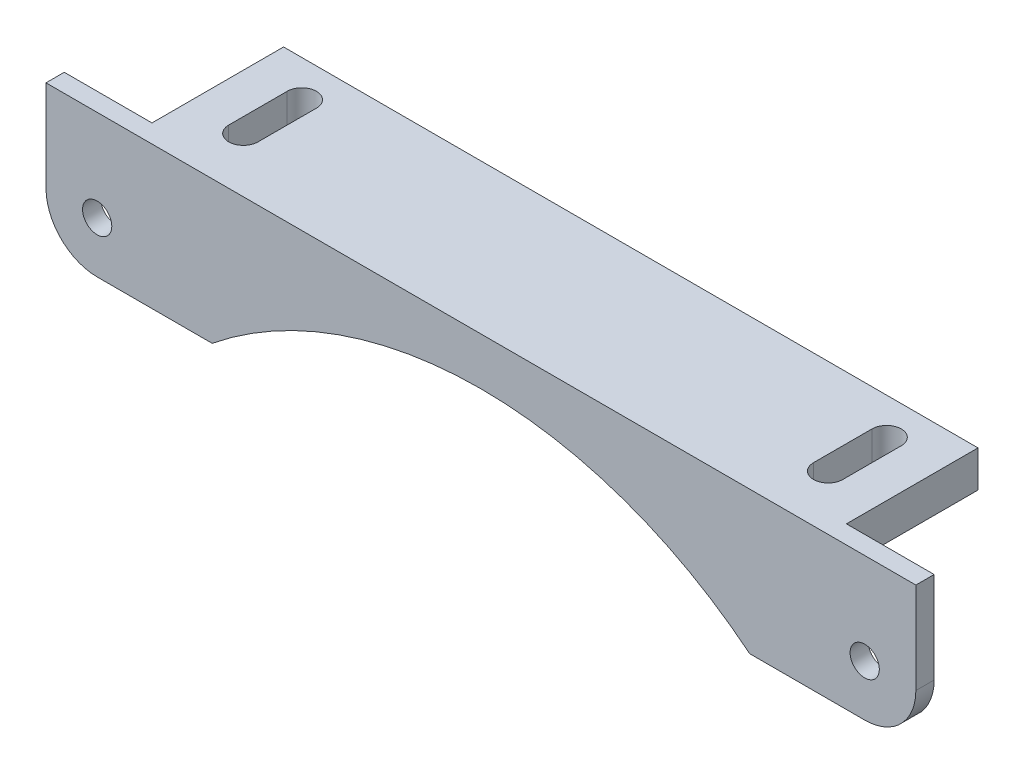
ISO-10303-21;
HEADER;
FILE_DESCRIPTION(('STEP AP214'),'2;1');
FILE_NAME('part.step','',(''),(''),'','','');
FILE_SCHEMA(('AUTOMOTIVE_DESIGN { 1 0 10303 214 1 1 1 1 }'));
ENDSEC;
DATA;
#1=APPLICATION_CONTEXT('core data for automotive mechanical design processes');
#2=APPLICATION_PROTOCOL_DEFINITION('international standard','automotive_design',2000,#1);
#3=PRODUCT_CONTEXT('',#1,'mechanical');
#4=PRODUCT('Part','Part','',(#3));
#5=PRODUCT_RELATED_PRODUCT_CATEGORY('part','',(#4));
#6=PRODUCT_DEFINITION_FORMATION('','',#4);
#7=PRODUCT_DEFINITION_CONTEXT('part definition',#1,'design');
#8=PRODUCT_DEFINITION('design','',#6,#7);
#9=PRODUCT_DEFINITION_SHAPE('','',#8);
#10=(LENGTH_UNIT() NAMED_UNIT(*) SI_UNIT(.MILLI.,.METRE.));
#11=(NAMED_UNIT(*) PLANE_ANGLE_UNIT() SI_UNIT($,.RADIAN.));
#12=(NAMED_UNIT(*) SI_UNIT($,.STERADIAN.) SOLID_ANGLE_UNIT());
#13=UNCERTAINTY_MEASURE_WITH_UNIT(LENGTH_MEASURE(1.E-05),#10,'distance_accuracy_value','');
#14=(GEOMETRIC_REPRESENTATION_CONTEXT(3) GLOBAL_UNCERTAINTY_ASSIGNED_CONTEXT((#13)) GLOBAL_UNIT_ASSIGNED_CONTEXT((#10,
#11,#12)) REPRESENTATION_CONTEXT('',''));
#15=CARTESIAN_POINT('',(0.,0.,0.));
#16=DIRECTION('',(0.,0.,1.));
#17=DIRECTION('',(1.,0.,0.));
#18=AXIS2_PLACEMENT_3D('',#15,#16,#17);
#19=CARTESIAN_POINT('',(0.,5.,0.));
#20=DIRECTION('',(0.,1.,0.));
#21=DIRECTION('',(0.,0.,1.));
#22=AXIS2_PLACEMENT_3D('',#19,#20,#21);
#23=PLANE('',#22);
#24=DIRECTION('',(0.,0.,1.));
#25=VECTOR('',#24,1.);
#26=CARTESIAN_POINT('',(-47.5,5.,9.00000000000001));
#27=LINE('',#26,#25);
#28=CARTESIAN_POINT('',(-47.5,5.,-8.99999999999999));
#29=VERTEX_POINT('',#28);
#30=CARTESIAN_POINT('',(-47.5,5.,9.00000000000001));
#31=VERTEX_POINT('',#30);
#32=EDGE_CURVE('E313',#29,#31,#27,.T.);
#33=ORIENTED_EDGE('',*,*,#32,.T.);
#34=DIRECTION('',(-1.,0.,0.));
#35=VECTOR('',#34,1.);
#36=CARTESIAN_POINT('',(0.,5.00000000000001,9.));
#37=LINE('',#36,#35);
#38=CARTESIAN_POINT('',(-59.5,5.,9.));
#39=VERTEX_POINT('',#38);
#40=EDGE_CURVE('E188',#31,#39,#37,.T.);
#41=ORIENTED_EDGE('',*,*,#40,.T.);
#42=DIRECTION('',(0.,0.,-1.));
#43=VECTOR('',#42,1.);
#44=CARTESIAN_POINT('',(-59.5,5.,11.5));
#45=LINE('',#44,#43);
#46=CARTESIAN_POINT('',(-59.5,5.,11.5));
#47=VERTEX_POINT('',#46);
#48=EDGE_CURVE('E185',#47,#39,#45,.T.);
#49=ORIENTED_EDGE('',*,*,#48,.F.);
#50=DIRECTION('',(-1.,0.,0.));
#51=VECTOR('',#50,1.);
#52=CARTESIAN_POINT('',(0.,5.00000000000001,11.5));
#53=LINE('',#52,#51);
#54=CARTESIAN_POINT('',(59.5,5.,11.5));
#55=VERTEX_POINT('',#54);
#56=EDGE_CURVE('E173',#55,#47,#53,.T.);
#57=ORIENTED_EDGE('',*,*,#56,.F.);
#58=DIRECTION('',(0.,0.,-1.));
#59=VECTOR('',#58,1.);
#60=CARTESIAN_POINT('',(59.5,5.,11.5));
#61=LINE('',#60,#59);
#62=CARTESIAN_POINT('',(59.5,5.,9.));
#63=VERTEX_POINT('',#62);
#64=EDGE_CURVE('E215',#55,#63,#61,.T.);
#65=ORIENTED_EDGE('',*,*,#64,.T.);
#66=CARTESIAN_POINT('',(47.5,5.,9.));
#67=VERTEX_POINT('',#66);
#68=EDGE_CURVE('E216',#63,#67,#37,.T.);
#69=ORIENTED_EDGE('',*,*,#68,.T.);
#70=DIRECTION('',(0.,0.,-1.));
#71=VECTOR('',#70,1.);
#72=CARTESIAN_POINT('',(47.5,5.,9.));
#73=LINE('',#72,#71);
#74=CARTESIAN_POINT('',(47.5,5.,-9.00000000000001));
#75=VERTEX_POINT('',#74);
#76=EDGE_CURVE('E315',#67,#75,#73,.T.);
#77=ORIENTED_EDGE('',*,*,#76,.T.);
#78=DIRECTION('',(-1.,0.,0.));
#79=VECTOR('',#78,1.);
#80=CARTESIAN_POINT('',(47.5,5.,-9.00000000000001));
#81=LINE('',#80,#79);
#82=EDGE_CURVE('E318',#75,#29,#81,.T.);
#83=ORIENTED_EDGE('',*,*,#82,.T.);
#84=EDGE_LOOP('',(#33,#41,#49,#57,#65,#69,#77,#83));
#85=FACE_BOUND('',#84,.T.);
#86=DIRECTION('',(0.,0.,1.));
#87=VECTOR('',#86,1.);
#88=CARTESIAN_POINT('',(-42.,5.,-3.99999999999996));
#89=LINE('',#88,#87);
#90=CARTESIAN_POINT('',(-42.,5.,-3.99999999999996));
#91=VERTEX_POINT('',#90);
#92=CARTESIAN_POINT('',(-42.,5.,3.99999999999998));
#93=VERTEX_POINT('',#92);
#94=EDGE_CURVE('E284',#91,#93,#89,.T.);
#95=ORIENTED_EDGE('',*,*,#94,.F.);
#96=CARTESIAN_POINT('',(-40.,5.,-4.00000000000002));
#97=DIRECTION('',(0.,1.,0.));
#98=DIRECTION('',(0.,0.,1.));
#99=AXIS2_PLACEMENT_3D('',#96,#97,#98);
#100=CIRCLE('',#99,2.);
#101=CARTESIAN_POINT('',(-38.,5.,-3.99999999999997));
#102=VERTEX_POINT('',#101);
#103=EDGE_CURVE('E282',#102,#91,#100,.T.);
#104=ORIENTED_EDGE('',*,*,#103,.F.);
#105=DIRECTION('',(0.,0.,-1.));
#106=VECTOR('',#105,1.);
#107=CARTESIAN_POINT('',(-38.,5.,-3.99999999999997));
#108=LINE('',#107,#106);
#109=CARTESIAN_POINT('',(-38.,5.,3.99999999999998));
#110=VERTEX_POINT('',#109);
#111=EDGE_CURVE('E290',#110,#102,#108,.T.);
#112=ORIENTED_EDGE('',*,*,#111,.F.);
#113=CARTESIAN_POINT('',(-40.,5.,3.99999999999998));
#114=DIRECTION('',(0.,1.,0.));
#115=DIRECTION('',(0.,0.,1.));
#116=AXIS2_PLACEMENT_3D('',#113,#114,#115);
#117=CIRCLE('',#116,2.);
#118=EDGE_CURVE('E287',#93,#110,#117,.T.);
#119=ORIENTED_EDGE('',*,*,#118,.F.);
#120=EDGE_LOOP('',(#95,#104,#112,#119));
#121=FACE_BOUND('',#120,.T.);
#122=DIRECTION('',(0.,0.,1.));
#123=VECTOR('',#122,1.);
#124=CARTESIAN_POINT('',(38.,5.,-4.));
#125=LINE('',#124,#123);
#126=CARTESIAN_POINT('',(38.,5.,-4.));
#127=VERTEX_POINT('',#126);
#128=CARTESIAN_POINT('',(38.,5.,4.));
#129=VERTEX_POINT('',#128);
#130=EDGE_CURVE('E258',#127,#129,#125,.T.);
#131=ORIENTED_EDGE('',*,*,#130,.F.);
#132=CARTESIAN_POINT('',(40.,5.,-4.));
#133=DIRECTION('',(0.,1.,0.));
#134=DIRECTION('',(0.,0.,1.));
#135=AXIS2_PLACEMENT_3D('',#132,#133,#134);
#136=CIRCLE('',#135,2.);
#137=CARTESIAN_POINT('',(42.,5.,-4.));
#138=VERTEX_POINT('',#137);
#139=EDGE_CURVE('E256',#138,#127,#136,.T.);
#140=ORIENTED_EDGE('',*,*,#139,.F.);
#141=DIRECTION('',(0.,0.,-1.));
#142=VECTOR('',#141,1.);
#143=CARTESIAN_POINT('',(42.,5.,-4.));
#144=LINE('',#143,#142);
#145=CARTESIAN_POINT('',(42.,5.,4.));
#146=VERTEX_POINT('',#145);
#147=EDGE_CURVE('E263',#146,#138,#144,.T.);
#148=ORIENTED_EDGE('',*,*,#147,.F.);
#149=CARTESIAN_POINT('',(40.,5.,4.));
#150=DIRECTION('',(0.,1.,0.));
#151=DIRECTION('',(0.,0.,1.));
#152=AXIS2_PLACEMENT_3D('',#149,#150,#151);
#153=CIRCLE('',#152,2.);
#154=EDGE_CURVE('E261',#129,#146,#153,.T.);
#155=ORIENTED_EDGE('',*,*,#154,.F.);
#156=EDGE_LOOP('',(#131,#140,#148,#155));
#157=FACE_BOUND('',#156,.T.);
#158=ADVANCED_FACE('F33',(#85,#121,#157),#23,.T.);
#159=CARTESIAN_POINT('',(0.,0.,0.));
#160=DIRECTION('',(0.,1.,0.));
#161=DIRECTION('',(0.,0.,1.));
#162=AXIS2_PLACEMENT_3D('',#159,#160,#161);
#163=PLANE('',#162);
#164=CARTESIAN_POINT('',(-40.,0.,-4.00000000000002));
#165=DIRECTION('',(0.,1.,0.));
#166=DIRECTION('',(0.,0.,1.));
#167=AXIS2_PLACEMENT_3D('',#164,#165,#166);
#168=CIRCLE('',#167,2.);
#169=CARTESIAN_POINT('',(-38.,0.,-3.99999999999997));
#170=VERTEX_POINT('',#169);
#171=CARTESIAN_POINT('',(-42.,0.,-3.99999999999996));
#172=VERTEX_POINT('',#171);
#173=EDGE_CURVE('E281',#170,#172,#168,.T.);
#174=ORIENTED_EDGE('',*,*,#173,.T.);
#175=DIRECTION('',(0.,0.,1.));
#176=VECTOR('',#175,1.);
#177=CARTESIAN_POINT('',(-42.,0.,-3.99999999999996));
#178=LINE('',#177,#176);
#179=CARTESIAN_POINT('',(-42.,0.,3.99999999999998));
#180=VERTEX_POINT('',#179);
#181=EDGE_CURVE('E295',#172,#180,#178,.T.);
#182=ORIENTED_EDGE('',*,*,#181,.T.);
#183=CARTESIAN_POINT('',(-40.,0.,3.99999999999998));
#184=DIRECTION('',(0.,1.,0.));
#185=DIRECTION('',(0.,0.,1.));
#186=AXIS2_PLACEMENT_3D('',#183,#184,#185);
#187=CIRCLE('',#186,2.);
#188=CARTESIAN_POINT('',(-38.,0.,3.99999999999998));
#189=VERTEX_POINT('',#188);
#190=EDGE_CURVE('E298',#180,#189,#187,.T.);
#191=ORIENTED_EDGE('',*,*,#190,.T.);
#192=DIRECTION('',(0.,0.,-1.));
#193=VECTOR('',#192,1.);
#194=CARTESIAN_POINT('',(-38.,0.,-3.99999999999997));
#195=LINE('',#194,#193);
#196=EDGE_CURVE('E285',#189,#170,#195,.T.);
#197=ORIENTED_EDGE('',*,*,#196,.T.);
#198=EDGE_LOOP('',(#174,#182,#191,#197));
#199=FACE_BOUND('',#198,.T.);
#200=DIRECTION('',(0.,0.,1.));
#201=VECTOR('',#200,1.);
#202=CARTESIAN_POINT('',(-47.5,0.,9.00000000000001));
#203=LINE('',#202,#201);
#204=CARTESIAN_POINT('',(-47.5,0.,-8.99999999999999));
#205=VERTEX_POINT('',#204);
#206=CARTESIAN_POINT('',(-47.5,0.,9.00000000000001));
#207=VERTEX_POINT('',#206);
#208=EDGE_CURVE('E312',#205,#207,#203,.T.);
#209=ORIENTED_EDGE('',*,*,#208,.F.);
#210=DIRECTION('',(-1.,0.,0.));
#211=VECTOR('',#210,1.);
#212=CARTESIAN_POINT('',(47.5,0.,-9.00000000000001));
#213=LINE('',#212,#211);
#214=CARTESIAN_POINT('',(47.5,0.,-9.00000000000001));
#215=VERTEX_POINT('',#214);
#216=EDGE_CURVE('E316',#215,#205,#213,.T.);
#217=ORIENTED_EDGE('',*,*,#216,.F.);
#218=DIRECTION('',(0.,0.,-1.));
#219=VECTOR('',#218,1.);
#220=CARTESIAN_POINT('',(47.5,0.,9.));
#221=LINE('',#220,#219);
#222=CARTESIAN_POINT('',(47.5,0.,9.));
#223=VERTEX_POINT('',#222);
#224=EDGE_CURVE('E325',#223,#215,#221,.T.);
#225=ORIENTED_EDGE('',*,*,#224,.F.);
#226=DIRECTION('',(1.,0.,0.));
#227=VECTOR('',#226,1.);
#228=CARTESIAN_POINT('',(47.5,0.,9.));
#229=LINE('',#228,#227);
#230=EDGE_CURVE('E322',#207,#223,#229,.T.);
#231=ORIENTED_EDGE('',*,*,#230,.F.);
#232=EDGE_LOOP('',(#209,#217,#225,#231));
#233=FACE_BOUND('',#232,.T.);
#234=CARTESIAN_POINT('',(40.,0.,-4.));
#235=DIRECTION('',(0.,1.,0.));
#236=DIRECTION('',(0.,0.,1.));
#237=AXIS2_PLACEMENT_3D('',#234,#235,#236);
#238=CIRCLE('',#237,2.);
#239=CARTESIAN_POINT('',(42.,0.,-4.));
#240=VERTEX_POINT('',#239);
#241=CARTESIAN_POINT('',(38.,0.,-4.));
#242=VERTEX_POINT('',#241);
#243=EDGE_CURVE('E56',#240,#242,#238,.T.);
#244=ORIENTED_EDGE('',*,*,#243,.T.);
#245=DIRECTION('',(0.,0.,1.));
#246=VECTOR('',#245,1.);
#247=CARTESIAN_POINT('',(38.,0.,-4.));
#248=LINE('',#247,#246);
#249=CARTESIAN_POINT('',(38.,0.,4.));
#250=VERTEX_POINT('',#249);
#251=EDGE_CURVE('E267',#242,#250,#248,.T.);
#252=ORIENTED_EDGE('',*,*,#251,.T.);
#253=CARTESIAN_POINT('',(40.,0.,4.));
#254=DIRECTION('',(0.,1.,0.));
#255=DIRECTION('',(0.,0.,1.));
#256=AXIS2_PLACEMENT_3D('',#253,#254,#255);
#257=CIRCLE('',#256,2.);
#258=CARTESIAN_POINT('',(42.,0.,4.));
#259=VERTEX_POINT('',#258);
#260=EDGE_CURVE('E270',#250,#259,#257,.T.);
#261=ORIENTED_EDGE('',*,*,#260,.T.);
#262=DIRECTION('',(0.,0.,-1.));
#263=VECTOR('',#262,1.);
#264=CARTESIAN_POINT('',(42.,0.,-4.));
#265=LINE('',#264,#263);
#266=EDGE_CURVE('E259',#259,#240,#265,.T.);
#267=ORIENTED_EDGE('',*,*,#266,.T.);
#268=EDGE_LOOP('',(#244,#252,#261,#267));
#269=FACE_BOUND('',#268,.T.);
#270=ADVANCED_FACE('F343',(#199,#233,#269),#163,.F.);
#271=CARTESIAN_POINT('',(-47.5,5.,9.00000000000001));
#272=DIRECTION('',(1.,0.,0.));
#273=DIRECTION('',(0.,0.,-1.));
#274=AXIS2_PLACEMENT_3D('',#271,#272,#273);
#275=PLANE('',#274);
#276=ORIENTED_EDGE('',*,*,#208,.T.);
#277=DIRECTION('',(0.,-1.,0.));
#278=VECTOR('',#277,1.);
#279=CARTESIAN_POINT('',(-47.5,5.,9.00000000000001));
#280=LINE('',#279,#278);
#281=EDGE_CURVE('E11',#31,#207,#280,.T.);
#282=ORIENTED_EDGE('',*,*,#281,.F.);
#283=ORIENTED_EDGE('',*,*,#32,.F.);
#284=DIRECTION('',(0.,-1.,0.));
#285=VECTOR('',#284,1.);
#286=CARTESIAN_POINT('',(-47.5,5.,-8.99999999999999));
#287=LINE('',#286,#285);
#288=EDGE_CURVE('E320',#29,#205,#287,.T.);
#289=ORIENTED_EDGE('',*,*,#288,.T.);
#290=EDGE_LOOP('',(#276,#282,#283,#289));
#291=FACE_BOUND('',#290,.T.);
#292=ADVANCED_FACE('F35',(#291),#275,.F.);
#293=CARTESIAN_POINT('',(47.5,5.,9.));
#294=DIRECTION('',(-1.,0.,0.));
#295=DIRECTION('',(0.,0.,1.));
#296=AXIS2_PLACEMENT_3D('',#293,#294,#295);
#297=PLANE('',#296);
#298=ORIENTED_EDGE('',*,*,#224,.T.);
#299=DIRECTION('',(0.,-1.,0.));
#300=VECTOR('',#299,1.);
#301=CARTESIAN_POINT('',(47.5,5.,-9.00000000000001));
#302=LINE('',#301,#300);
#303=EDGE_CURVE('E330',#75,#215,#302,.T.);
#304=ORIENTED_EDGE('',*,*,#303,.F.);
#305=ORIENTED_EDGE('',*,*,#76,.F.);
#306=DIRECTION('',(0.,-1.,0.));
#307=VECTOR('',#306,1.);
#308=CARTESIAN_POINT('',(47.5,5.,9.));
#309=LINE('',#308,#307);
#310=EDGE_CURVE('E41',#67,#223,#309,.T.);
#311=ORIENTED_EDGE('',*,*,#310,.T.);
#312=EDGE_LOOP('',(#298,#304,#305,#311));
#313=FACE_BOUND('',#312,.T.);
#314=ADVANCED_FACE('F335',(#313),#297,.F.);
#315=CARTESIAN_POINT('',(47.5,5.,-9.00000000000001));
#316=DIRECTION('',(0.,0.,1.));
#317=DIRECTION('',(1.,0.,0.));
#318=AXIS2_PLACEMENT_3D('',#315,#316,#317);
#319=PLANE('',#318);
#320=ORIENTED_EDGE('',*,*,#216,.T.);
#321=ORIENTED_EDGE('',*,*,#288,.F.);
#322=ORIENTED_EDGE('',*,*,#82,.F.);
#323=ORIENTED_EDGE('',*,*,#303,.T.);
#324=EDGE_LOOP('',(#320,#321,#322,#323));
#325=FACE_BOUND('',#324,.T.);
#326=ADVANCED_FACE('F353',(#325),#319,.F.);
#327=CARTESIAN_POINT('',(-40.,5.,-4.00000000000002));
#328=DIRECTION('',(0.,-1.,0.));
#329=DIRECTION('',(0.,0.,-1.));
#330=AXIS2_PLACEMENT_3D('',#327,#328,#329);
#331=CYLINDRICAL_SURFACE('',#330,2.);
#332=ORIENTED_EDGE('',*,*,#173,.F.);
#333=DIRECTION('',(0.,-1.,0.));
#334=VECTOR('',#333,1.);
#335=CARTESIAN_POINT('',(-38.,5.,-3.99999999999997));
#336=LINE('',#335,#334);
#337=EDGE_CURVE('E292',#102,#170,#336,.T.);
#338=ORIENTED_EDGE('',*,*,#337,.F.);
#339=ORIENTED_EDGE('',*,*,#103,.T.);
#340=DIRECTION('',(0.,-1.,0.));
#341=VECTOR('',#340,1.);
#342=CARTESIAN_POINT('',(-42.,5.,-3.99999999999996));
#343=LINE('',#342,#341);
#344=EDGE_CURVE('E309',#91,#172,#343,.T.);
#345=ORIENTED_EDGE('',*,*,#344,.T.);
#346=EDGE_LOOP('',(#332,#338,#339,#345));
#347=FACE_BOUND('',#346,.T.);
#348=ADVANCED_FACE('F398',(#347),#331,.F.);
#349=CARTESIAN_POINT('',(-42.,5.,-3.99999999999996));
#350=DIRECTION('',(1.,0.,0.));
#351=DIRECTION('',(0.,0.,-1.));
#352=AXIS2_PLACEMENT_3D('',#349,#350,#351);
#353=PLANE('',#352);
#354=ORIENTED_EDGE('',*,*,#181,.F.);
#355=ORIENTED_EDGE('',*,*,#344,.F.);
#356=ORIENTED_EDGE('',*,*,#94,.T.);
#357=DIRECTION('',(0.,-1.,0.));
#358=VECTOR('',#357,1.);
#359=CARTESIAN_POINT('',(-42.,5.,3.99999999999998));
#360=LINE('',#359,#358);
#361=EDGE_CURVE('E307',#93,#180,#360,.T.);
#362=ORIENTED_EDGE('',*,*,#361,.T.);
#363=EDGE_LOOP('',(#354,#355,#356,#362));
#364=FACE_BOUND('',#363,.T.);
#365=ADVANCED_FACE('F477',(#364),#353,.T.);
#366=CARTESIAN_POINT('',(-40.,5.,3.99999999999998));
#367=DIRECTION('',(0.,-1.,0.));
#368=DIRECTION('',(0.,0.,-1.));
#369=AXIS2_PLACEMENT_3D('',#366,#367,#368);
#370=CYLINDRICAL_SURFACE('',#369,2.);
#371=ORIENTED_EDGE('',*,*,#190,.F.);
#372=ORIENTED_EDGE('',*,*,#361,.F.);
#373=ORIENTED_EDGE('',*,*,#118,.T.);
#374=DIRECTION('',(0.,-1.,0.));
#375=VECTOR('',#374,1.);
#376=CARTESIAN_POINT('',(-38.,5.,3.99999999999998));
#377=LINE('',#376,#375);
#378=EDGE_CURVE('E305',#110,#189,#377,.T.);
#379=ORIENTED_EDGE('',*,*,#378,.T.);
#380=EDGE_LOOP('',(#371,#372,#373,#379));
#381=FACE_BOUND('',#380,.T.);
#382=ADVANCED_FACE('F467',(#381),#370,.F.);
#383=CARTESIAN_POINT('',(-38.,5.,-3.99999999999997));
#384=DIRECTION('',(-1.,0.,0.));
#385=DIRECTION('',(0.,0.,1.));
#386=AXIS2_PLACEMENT_3D('',#383,#384,#385);
#387=PLANE('',#386);
#388=ORIENTED_EDGE('',*,*,#196,.F.);
#389=ORIENTED_EDGE('',*,*,#378,.F.);
#390=ORIENTED_EDGE('',*,*,#111,.T.);
#391=ORIENTED_EDGE('',*,*,#337,.T.);
#392=EDGE_LOOP('',(#388,#389,#390,#391));
#393=FACE_BOUND('',#392,.T.);
#394=ADVANCED_FACE('F458',(#393),#387,.T.);
#395=CARTESIAN_POINT('',(40.,5.,-4.));
#396=DIRECTION('',(0.,-1.,0.));
#397=DIRECTION('',(0.,0.,-1.));
#398=AXIS2_PLACEMENT_3D('',#395,#396,#397);
#399=CYLINDRICAL_SURFACE('',#398,2.);
#400=ORIENTED_EDGE('',*,*,#243,.F.);
#401=DIRECTION('',(0.,-1.,0.));
#402=VECTOR('',#401,1.);
#403=CARTESIAN_POINT('',(42.,5.,-4.));
#404=LINE('',#403,#402);
#405=EDGE_CURVE('E265',#138,#240,#404,.T.);
#406=ORIENTED_EDGE('',*,*,#405,.F.);
#407=ORIENTED_EDGE('',*,*,#139,.T.);
#408=DIRECTION('',(0.,-1.,0.));
#409=VECTOR('',#408,1.);
#410=CARTESIAN_POINT('',(38.,5.,-4.));
#411=LINE('',#410,#409);
#412=EDGE_CURVE('E279',#127,#242,#411,.T.);
#413=ORIENTED_EDGE('',*,*,#412,.T.);
#414=EDGE_LOOP('',(#400,#406,#407,#413));
#415=FACE_BOUND('',#414,.T.);
#416=ADVANCED_FACE('F448',(#415),#399,.F.);
#417=CARTESIAN_POINT('',(38.,5.,-4.));
#418=DIRECTION('',(1.,0.,0.));
#419=DIRECTION('',(0.,0.,-1.));
#420=AXIS2_PLACEMENT_3D('',#417,#418,#419);
#421=PLANE('',#420);
#422=ORIENTED_EDGE('',*,*,#251,.F.);
#423=ORIENTED_EDGE('',*,*,#412,.F.);
#424=ORIENTED_EDGE('',*,*,#130,.T.);
#425=DIRECTION('',(0.,-1.,0.));
#426=VECTOR('',#425,1.);
#427=CARTESIAN_POINT('',(38.,5.,4.));
#428=LINE('',#427,#426);
#429=EDGE_CURVE('E277',#129,#250,#428,.T.);
#430=ORIENTED_EDGE('',*,*,#429,.T.);
#431=EDGE_LOOP('',(#422,#423,#424,#430));
#432=FACE_BOUND('',#431,.T.);
#433=ADVANCED_FACE('F438',(#432),#421,.T.);
#434=CARTESIAN_POINT('',(40.,5.,4.));
#435=DIRECTION('',(0.,-1.,0.));
#436=DIRECTION('',(0.,0.,-1.));
#437=AXIS2_PLACEMENT_3D('',#434,#435,#436);
#438=CYLINDRICAL_SURFACE('',#437,2.);
#439=ORIENTED_EDGE('',*,*,#260,.F.);
#440=ORIENTED_EDGE('',*,*,#429,.F.);
#441=ORIENTED_EDGE('',*,*,#154,.T.);
#442=DIRECTION('',(0.,-1.,0.));
#443=VECTOR('',#442,1.);
#444=CARTESIAN_POINT('',(42.,5.,4.));
#445=LINE('',#444,#443);
#446=EDGE_CURVE('E48',#146,#259,#445,.T.);
#447=ORIENTED_EDGE('',*,*,#446,.T.);
#448=EDGE_LOOP('',(#439,#440,#441,#447));
#449=FACE_BOUND('',#448,.T.);
#450=ADVANCED_FACE('F428',(#449),#438,.F.);
#451=CARTESIAN_POINT('',(42.,5.,-4.));
#452=DIRECTION('',(-1.,0.,0.));
#453=DIRECTION('',(0.,0.,1.));
#454=AXIS2_PLACEMENT_3D('',#451,#452,#453);
#455=PLANE('',#454);
#456=ORIENTED_EDGE('',*,*,#266,.F.);
#457=ORIENTED_EDGE('',*,*,#446,.F.);
#458=ORIENTED_EDGE('',*,*,#147,.T.);
#459=ORIENTED_EDGE('',*,*,#405,.T.);
#460=EDGE_LOOP('',(#456,#457,#458,#459));
#461=FACE_BOUND('',#460,.T.);
#462=ADVANCED_FACE('F388',(#461),#455,.T.);
#463=CARTESIAN_POINT('',(-59.5,0.,11.5));
#464=DIRECTION('',(-1.,0.,0.));
#465=DIRECTION('',(0.,0.,1.));
#466=AXIS2_PLACEMENT_3D('',#463,#464,#465);
#467=PLANE('',#466);
#468=DIRECTION('',(0.,1.,0.));
#469=VECTOR('',#468,1.);
#470=CARTESIAN_POINT('',(-59.5,0.,9.));
#471=LINE('',#470,#469);
#472=CARTESIAN_POINT('',(-59.5,-7.50000000000001,9.));
#473=VERTEX_POINT('',#472);
#474=EDGE_CURVE('E219',#473,#39,#471,.T.);
#475=ORIENTED_EDGE('',*,*,#474,.F.);
#476=DIRECTION('',(0.,0.,-1.));
#477=VECTOR('',#476,1.);
#478=CARTESIAN_POINT('',(-59.5,-7.50000000000001,11.5));
#479=LINE('',#478,#477);
#480=CARTESIAN_POINT('',(-59.5,-7.50000000000001,11.5));
#481=VERTEX_POINT('',#480);
#482=EDGE_CURVE('E192',#481,#473,#479,.T.);
#483=ORIENTED_EDGE('',*,*,#482,.F.);
#484=DIRECTION('',(0.,1.,0.));
#485=VECTOR('',#484,1.);
#486=CARTESIAN_POINT('',(-59.5,0.,11.5));
#487=LINE('',#486,#485);
#488=EDGE_CURVE('E178',#481,#47,#487,.T.);
#489=ORIENTED_EDGE('',*,*,#488,.T.);
#490=ORIENTED_EDGE('',*,*,#48,.T.);
#491=EDGE_LOOP('',(#475,#483,#489,#490));
#492=FACE_BOUND('',#491,.T.);
#493=ADVANCED_FACE('F194',(#492),#467,.T.);
#494=CARTESIAN_POINT('',(-52.5,-7.50000000000001,11.5));
#495=DIRECTION('',(0.,0.,-1.));
#496=DIRECTION('',(-1.,0.,0.));
#497=AXIS2_PLACEMENT_3D('',#494,#495,#496);
#498=CYLINDRICAL_SURFACE('',#497,6.99999999999999);
#499=CARTESIAN_POINT('',(-52.5,-7.50000000000001,9.));
#500=DIRECTION('',(0.,0.,1.));
#501=DIRECTION('',(1.,0.,0.));
#502=AXIS2_PLACEMENT_3D('',#499,#500,#501);
#503=CIRCLE('',#502,6.99999999999999);
#504=CARTESIAN_POINT('',(-52.5,-14.5,9.));
#505=VERTEX_POINT('',#504);
#506=EDGE_CURVE('E221',#473,#505,#503,.T.);
#507=ORIENTED_EDGE('',*,*,#506,.T.);
#508=DIRECTION('',(0.,0.,-1.));
#509=VECTOR('',#508,1.);
#510=CARTESIAN_POINT('',(-52.5,-14.5,11.5));
#511=LINE('',#510,#509);
#512=CARTESIAN_POINT('',(-52.5,-14.5,11.5));
#513=VERTEX_POINT('',#512);
#514=EDGE_CURVE('E252',#513,#505,#511,.T.);
#515=ORIENTED_EDGE('',*,*,#514,.F.);
#516=CARTESIAN_POINT('',(-52.5,-7.50000000000001,11.5));
#517=DIRECTION('',(0.,0.,1.));
#518=DIRECTION('',(1.,0.,0.));
#519=AXIS2_PLACEMENT_3D('',#516,#517,#518);
#520=CIRCLE('',#519,6.99999999999999);
#521=EDGE_CURVE('E196',#481,#513,#520,.T.);
#522=ORIENTED_EDGE('',*,*,#521,.F.);
#523=ORIENTED_EDGE('',*,*,#482,.T.);
#524=EDGE_LOOP('',(#507,#515,#522,#523));
#525=FACE_BOUND('',#524,.T.);
#526=ADVANCED_FACE('F380',(#525),#498,.T.);
#527=CARTESIAN_POINT('',(0.,-14.5,11.5));
#528=DIRECTION('',(0.,1.,0.));
#529=DIRECTION('',(0.,0.,1.));
#530=AXIS2_PLACEMENT_3D('',#527,#528,#529);
#531=PLANE('',#530);
#532=DIRECTION('',(1.,0.,0.));
#533=VECTOR('',#532,1.);
#534=CARTESIAN_POINT('',(0.,-14.5,9.));
#535=LINE('',#534,#533);
#536=CARTESIAN_POINT('',(-36.7695526217004,-14.5,9.));
#537=VERTEX_POINT('',#536);
#538=EDGE_CURVE('E223',#505,#537,#535,.T.);
#539=ORIENTED_EDGE('',*,*,#538,.T.);
#540=DIRECTION('',(0.,0.,-1.));
#541=VECTOR('',#540,1.);
#542=CARTESIAN_POINT('',(-36.7695526217004,-14.5,11.5));
#543=LINE('',#542,#541);
#544=CARTESIAN_POINT('',(-36.7695526217004,-14.5,11.5));
#545=VERTEX_POINT('',#544);
#546=EDGE_CURVE('E249',#545,#537,#543,.T.);
#547=ORIENTED_EDGE('',*,*,#546,.F.);
#548=DIRECTION('',(1.,0.,0.));
#549=VECTOR('',#548,1.);
#550=CARTESIAN_POINT('',(0.,-14.5,11.5));
#551=LINE('',#550,#549);
#552=EDGE_CURVE('E198',#513,#545,#551,.T.);
#553=ORIENTED_EDGE('',*,*,#552,.F.);
#554=ORIENTED_EDGE('',*,*,#514,.T.);
#555=EDGE_LOOP('',(#539,#547,#553,#554));
#556=FACE_BOUND('',#555,.T.);
#557=ADVANCED_FACE('F376',(#556),#531,.F.);
#558=CARTESIAN_POINT('',(0.,-60.,11.5));
#559=DIRECTION('',(0.,0.,-1.));
#560=DIRECTION('',(-1.,0.,0.));
#561=AXIS2_PLACEMENT_3D('',#558,#559,#560);
#562=CYLINDRICAL_SURFACE('',#561,58.5);
#563=CARTESIAN_POINT('',(0.,-60.,9.));
#564=DIRECTION('',(0.,0.,1.));
#565=DIRECTION('',(1.,0.,0.));
#566=AXIS2_PLACEMENT_3D('',#563,#564,#565);
#567=CIRCLE('',#566,58.5);
#568=CARTESIAN_POINT('',(36.7695526217004,-14.5,9.));
#569=VERTEX_POINT('',#568);
#570=EDGE_CURVE('E225',#537,#569,#567,.F.);
#571=ORIENTED_EDGE('',*,*,#570,.T.);
#572=DIRECTION('',(0.,0.,-1.));
#573=VECTOR('',#572,1.);
#574=CARTESIAN_POINT('',(36.7695526217004,-14.5,11.5));
#575=LINE('',#574,#573);
#576=CARTESIAN_POINT('',(36.7695526217004,-14.5,11.5));
#577=VERTEX_POINT('',#576);
#578=EDGE_CURVE('E246',#577,#569,#575,.T.);
#579=ORIENTED_EDGE('',*,*,#578,.F.);
#580=CARTESIAN_POINT('',(0.,-60.,11.5));
#581=DIRECTION('',(0.,0.,1.));
#582=DIRECTION('',(1.,0.,0.));
#583=AXIS2_PLACEMENT_3D('',#580,#581,#582);
#584=CIRCLE('',#583,58.5);
#585=EDGE_CURVE('E202',#545,#577,#584,.F.);
#586=ORIENTED_EDGE('',*,*,#585,.F.);
#587=ORIENTED_EDGE('',*,*,#546,.T.);
#588=EDGE_LOOP('',(#571,#579,#586,#587));
#589=FACE_BOUND('',#588,.T.);
#590=ADVANCED_FACE('F372',(#589),#562,.F.);
#591=CARTESIAN_POINT('',(0.,-14.5,11.5));
#592=DIRECTION('',(0.,1.,0.));
#593=DIRECTION('',(-1.,0.,0.));
#594=AXIS2_PLACEMENT_3D('',#591,#592,#593);
#595=PLANE('',#594);
#596=DIRECTION('',(1.,0.,0.));
#597=VECTOR('',#596,1.);
#598=CARTESIAN_POINT('',(0.,-14.5,9.));
#599=LINE('',#598,#597);
#600=CARTESIAN_POINT('',(52.5,-14.5,9.));
#601=VERTEX_POINT('',#600);
#602=EDGE_CURVE('E227',#569,#601,#599,.T.);
#603=ORIENTED_EDGE('',*,*,#602,.T.);
#604=DIRECTION('',(0.,0.,-1.));
#605=VECTOR('',#604,1.);
#606=CARTESIAN_POINT('',(52.5,-14.5,11.5));
#607=LINE('',#606,#605);
#608=CARTESIAN_POINT('',(52.5,-14.5,11.5));
#609=VERTEX_POINT('',#608);
#610=EDGE_CURVE('E243',#609,#601,#607,.T.);
#611=ORIENTED_EDGE('',*,*,#610,.F.);
#612=DIRECTION('',(1.,0.,0.));
#613=VECTOR('',#612,1.);
#614=CARTESIAN_POINT('',(0.,-14.5,11.5));
#615=LINE('',#614,#613);
#616=EDGE_CURVE('E204',#577,#609,#615,.T.);
#617=ORIENTED_EDGE('',*,*,#616,.F.);
#618=ORIENTED_EDGE('',*,*,#578,.T.);
#619=EDGE_LOOP('',(#603,#611,#617,#618));
#620=FACE_BOUND('',#619,.T.);
#621=ADVANCED_FACE('F367',(#620),#595,.F.);
#622=CARTESIAN_POINT('',(52.5,-7.5,11.5));
#623=DIRECTION('',(0.,0.,-1.));
#624=DIRECTION('',(-1.,0.,0.));
#625=AXIS2_PLACEMENT_3D('',#622,#623,#624);
#626=CYLINDRICAL_SURFACE('',#625,7.);
#627=CARTESIAN_POINT('',(52.5,-7.5,9.));
#628=DIRECTION('',(0.,0.,1.));
#629=DIRECTION('',(1.,0.,0.));
#630=AXIS2_PLACEMENT_3D('',#627,#628,#629);
#631=CIRCLE('',#630,7.);
#632=CARTESIAN_POINT('',(59.5,-7.5,9.));
#633=VERTEX_POINT('',#632);
#634=EDGE_CURVE('E229',#601,#633,#631,.T.);
#635=ORIENTED_EDGE('',*,*,#634,.T.);
#636=DIRECTION('',(0.,0.,-1.));
#637=VECTOR('',#636,1.);
#638=CARTESIAN_POINT('',(59.5,-7.5,11.5));
#639=LINE('',#638,#637);
#640=CARTESIAN_POINT('',(59.5,-7.5,11.5));
#641=VERTEX_POINT('',#640);
#642=EDGE_CURVE('E241',#641,#633,#639,.T.);
#643=ORIENTED_EDGE('',*,*,#642,.F.);
#644=CARTESIAN_POINT('',(52.5,-7.5,11.5));
#645=DIRECTION('',(0.,0.,1.));
#646=DIRECTION('',(1.,0.,0.));
#647=AXIS2_PLACEMENT_3D('',#644,#645,#646);
#648=CIRCLE('',#647,7.);
#649=EDGE_CURVE('E206',#609,#641,#648,.T.);
#650=ORIENTED_EDGE('',*,*,#649,.F.);
#651=ORIENTED_EDGE('',*,*,#610,.T.);
#652=EDGE_LOOP('',(#635,#643,#650,#651));
#653=FACE_BOUND('',#652,.T.);
#654=ADVANCED_FACE('F361',(#653),#626,.T.);
#655=CARTESIAN_POINT('',(-52.5,-7.50000000000001,11.5));
#656=DIRECTION('',(0.,0.,-1.));
#657=DIRECTION('',(-1.,0.,0.));
#658=AXIS2_PLACEMENT_3D('',#655,#656,#657);
#659=CYLINDRICAL_SURFACE('',#658,2.);
#660=CARTESIAN_POINT('',(-52.5,-7.50000000000001,11.5));
#661=DIRECTION('',(0.,0.,1.));
#662=DIRECTION('',(1.,0.,0.));
#663=AXIS2_PLACEMENT_3D('',#660,#661,#662);
#664=CIRCLE('',#663,2.);
#665=CARTESIAN_POINT('',(-50.5,-7.50000000000001,11.5));
#666=VERTEX_POINT('',#665);
#667=EDGE_CURVE('E209',#666,#666,#664,.T.);
#668=ORIENTED_EDGE('',*,*,#667,.T.);
#669=EDGE_LOOP('',(#668));
#670=FACE_BOUND('',#669,.T.);
#671=CARTESIAN_POINT('',(-52.5,-7.50000000000001,9.));
#672=DIRECTION('',(0.,0.,1.));
#673=DIRECTION('',(1.,0.,0.));
#674=AXIS2_PLACEMENT_3D('',#671,#672,#673);
#675=CIRCLE('',#674,2.);
#676=CARTESIAN_POINT('',(-50.5,-7.50000000000001,9.));
#677=VERTEX_POINT('',#676);
#678=EDGE_CURVE('E235',#677,#677,#675,.T.);
#679=ORIENTED_EDGE('',*,*,#678,.F.);
#680=EDGE_LOOP('',(#679));
#681=FACE_BOUND('',#680,.T.);
#682=ADVANCED_FACE('F546',(#670,#681),#659,.F.);
#683=CARTESIAN_POINT('',(59.5,0.,11.5));
#684=DIRECTION('',(1.,0.,0.));
#685=DIRECTION('',(0.,0.,-1.));
#686=AXIS2_PLACEMENT_3D('',#683,#684,#685);
#687=PLANE('',#686);
#688=DIRECTION('',(0.,-1.,0.));
#689=VECTOR('',#688,1.);
#690=CARTESIAN_POINT('',(59.5,0.,9.));
#691=LINE('',#690,#689);
#692=EDGE_CURVE('E232',#63,#633,#691,.T.);
#693=ORIENTED_EDGE('',*,*,#692,.F.);
#694=ORIENTED_EDGE('',*,*,#64,.F.);
#695=DIRECTION('',(0.,-1.,0.));
#696=VECTOR('',#695,1.);
#697=CARTESIAN_POINT('',(59.5,0.,11.5));
#698=LINE('',#697,#696);
#699=EDGE_CURVE('E180',#55,#641,#698,.T.);
#700=ORIENTED_EDGE('',*,*,#699,.T.);
#701=ORIENTED_EDGE('',*,*,#642,.T.);
#702=EDGE_LOOP('',(#693,#694,#700,#701));
#703=FACE_BOUND('',#702,.T.);
#704=ADVANCED_FACE('F357',(#703),#687,.T.);
#705=CARTESIAN_POINT('',(52.5,-7.5,11.5));
#706=DIRECTION('',(0.,0.,-1.));
#707=DIRECTION('',(-1.,0.,0.));
#708=AXIS2_PLACEMENT_3D('',#705,#706,#707);
#709=CYLINDRICAL_SURFACE('',#708,2.);
#710=CARTESIAN_POINT('',(52.5,-7.5,11.5));
#711=DIRECTION('',(0.,0.,1.));
#712=DIRECTION('',(1.,0.,0.));
#713=AXIS2_PLACEMENT_3D('',#710,#711,#712);
#714=CIRCLE('',#713,2.);
#715=CARTESIAN_POINT('',(54.5,-7.5,11.5));
#716=VERTEX_POINT('',#715);
#717=EDGE_CURVE('E212',#716,#716,#714,.T.);
#718=ORIENTED_EDGE('',*,*,#717,.T.);
#719=EDGE_LOOP('',(#718));
#720=FACE_BOUND('',#719,.T.);
#721=CARTESIAN_POINT('',(52.5,-7.5,9.));
#722=DIRECTION('',(0.,0.,1.));
#723=DIRECTION('',(1.,0.,0.));
#724=AXIS2_PLACEMENT_3D('',#721,#722,#723);
#725=CIRCLE('',#724,2.);
#726=CARTESIAN_POINT('',(54.5,-7.5,9.));
#727=VERTEX_POINT('',#726);
#728=EDGE_CURVE('E182',#727,#727,#725,.T.);
#729=ORIENTED_EDGE('',*,*,#728,.F.);
#730=EDGE_LOOP('',(#729));
#731=FACE_BOUND('',#730,.T.);
#732=ADVANCED_FACE('F564',(#720,#731),#709,.F.);
#733=CARTESIAN_POINT('',(0.,0.,11.5));
#734=DIRECTION('',(0.,0.,1.));
#735=DIRECTION('',(1.,0.,0.));
#736=AXIS2_PLACEMENT_3D('',#733,#734,#735);
#737=PLANE('',#736);
#738=ORIENTED_EDGE('',*,*,#56,.T.);
#739=ORIENTED_EDGE('',*,*,#488,.F.);
#740=ORIENTED_EDGE('',*,*,#521,.T.);
#741=ORIENTED_EDGE('',*,*,#552,.T.);
#742=ORIENTED_EDGE('',*,*,#585,.T.);
#743=ORIENTED_EDGE('',*,*,#616,.T.);
#744=ORIENTED_EDGE('',*,*,#649,.T.);
#745=ORIENTED_EDGE('',*,*,#699,.F.);
#746=EDGE_LOOP('',(#738,#739,#740,#741,#742,#743,#744,#745));
#747=FACE_BOUND('',#746,.T.);
#748=ORIENTED_EDGE('',*,*,#667,.F.);
#749=EDGE_LOOP('',(#748));
#750=FACE_BOUND('',#749,.T.);
#751=ORIENTED_EDGE('',*,*,#717,.F.);
#752=EDGE_LOOP('',(#751));
#753=FACE_BOUND('',#752,.T.);
#754=ADVANCED_FACE('F175',(#747,#750,#753),#737,.T.);
#755=CARTESIAN_POINT('',(0.,0.,9.));
#756=DIRECTION('',(0.,0.,1.));
#757=DIRECTION('',(1.,0.,0.));
#758=AXIS2_PLACEMENT_3D('',#755,#756,#757);
#759=PLANE('',#758);
#760=ORIENTED_EDGE('',*,*,#310,.F.);
#761=ORIENTED_EDGE('',*,*,#68,.F.);
#762=ORIENTED_EDGE('',*,*,#692,.T.);
#763=ORIENTED_EDGE('',*,*,#634,.F.);
#764=ORIENTED_EDGE('',*,*,#602,.F.);
#765=ORIENTED_EDGE('',*,*,#570,.F.);
#766=ORIENTED_EDGE('',*,*,#538,.F.);
#767=ORIENTED_EDGE('',*,*,#506,.F.);
#768=ORIENTED_EDGE('',*,*,#474,.T.);
#769=ORIENTED_EDGE('',*,*,#40,.F.);
#770=ORIENTED_EDGE('',*,*,#281,.T.);
#771=ORIENTED_EDGE('',*,*,#230,.T.);
#772=EDGE_LOOP('',(#760,#761,#762,#763,#764,#765,#766,#767,#768,#769,#770,#771));
#773=FACE_BOUND('',#772,.T.);
#774=ORIENTED_EDGE('',*,*,#678,.T.);
#775=EDGE_LOOP('',(#774));
#776=FACE_BOUND('',#775,.T.);
#777=ORIENTED_EDGE('',*,*,#728,.T.);
#778=EDGE_LOOP('',(#777));
#779=FACE_BOUND('',#778,.T.);
#780=ADVANCED_FACE('F345',(#773,#776,#779),#759,.F.);
#781=CLOSED_SHELL('',(#158,#270,#292,#314,#326,#348,#365,#382,#394,#416,#433,#450,#462,#493,
#526,#557,#590,#621,#654,#682,#704,#732,#754,#780));
#782=MANIFOLD_SOLID_BREP('B2',#781);
#783=ADVANCED_BREP_SHAPE_REPRESENTATION('',(#18,#782),#14);
#784=SHAPE_DEFINITION_REPRESENTATION(#9,#783);
ENDSEC;
END-ISO-10303-21;
